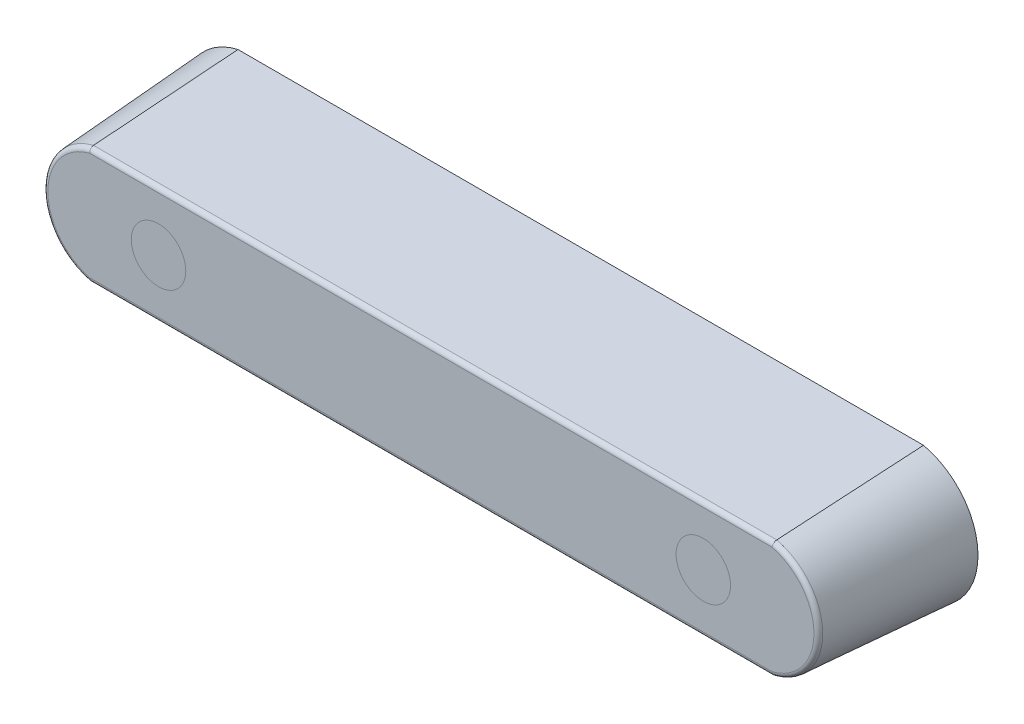
ISO-10303-21;
HEADER;
FILE_DESCRIPTION(('STEP AP214'),'2;1');
FILE_NAME('part.step','',(''),(''),'','','');
FILE_SCHEMA(('AUTOMOTIVE_DESIGN { 1 0 10303 214 1 1 1 1 }'));
ENDSEC;
DATA;
#1=APPLICATION_CONTEXT('core data for automotive mechanical design processes');
#2=APPLICATION_PROTOCOL_DEFINITION('international standard','automotive_design',2000,#1);
#3=PRODUCT_CONTEXT('',#1,'mechanical');
#4=PRODUCT('Part','Part','',(#3));
#5=PRODUCT_RELATED_PRODUCT_CATEGORY('part','',(#4));
#6=PRODUCT_DEFINITION_FORMATION('','',#4);
#7=PRODUCT_DEFINITION_CONTEXT('part definition',#1,'design');
#8=PRODUCT_DEFINITION('design','',#6,#7);
#9=PRODUCT_DEFINITION_SHAPE('','',#8);
#10=(LENGTH_UNIT() NAMED_UNIT(*) SI_UNIT(.MILLI.,.METRE.));
#11=(NAMED_UNIT(*) PLANE_ANGLE_UNIT() SI_UNIT($,.RADIAN.));
#12=(NAMED_UNIT(*) SI_UNIT($,.STERADIAN.) SOLID_ANGLE_UNIT());
#13=UNCERTAINTY_MEASURE_WITH_UNIT(LENGTH_MEASURE(1.E-05),#10,'distance_accuracy_value','');
#14=(GEOMETRIC_REPRESENTATION_CONTEXT(3) GLOBAL_UNCERTAINTY_ASSIGNED_CONTEXT((#13)) GLOBAL_UNIT_ASSIGNED_CONTEXT((#10,
#11,#12)) REPRESENTATION_CONTEXT('',''));
#15=CARTESIAN_POINT('',(0.,0.,0.));
#16=DIRECTION('',(0.,0.,1.));
#17=DIRECTION('',(1.,0.,0.));
#18=AXIS2_PLACEMENT_3D('',#15,#16,#17);
#19=CARTESIAN_POINT('',(60.,0.,33.));
#20=DIRECTION('',(0.,0.,-1.));
#21=DIRECTION('',(-1.,0.,0.));
#22=AXIS2_PLACEMENT_3D('',#19,#20,#21);
#23=CYLINDRICAL_SURFACE('',#22,6.);
#24=CARTESIAN_POINT('',(60.,0.,33.));
#25=DIRECTION('',(0.,0.,1.));
#26=DIRECTION('',(1.,0.,0.));
#27=AXIS2_PLACEMENT_3D('',#24,#25,#26);
#28=CIRCLE('',#27,6.);
#29=CARTESIAN_POINT('',(66.,0.,33.));
#30=VERTEX_POINT('',#29);
#31=EDGE_CURVE('P0_E10',#30,#30,#28,.T.);
#32=ORIENTED_EDGE('',*,*,#31,.F.);
#33=EDGE_LOOP('',(#32));
#34=FACE_BOUND('',#33,.T.);
#35=CARTESIAN_POINT('',(60.,0.,31.));
#36=DIRECTION('',(0.,0.,1.));
#37=DIRECTION('',(1.,0.,0.));
#38=AXIS2_PLACEMENT_3D('',#35,#36,#37);
#39=CIRCLE('',#38,6.);
#40=CARTESIAN_POINT('',(66.,0.,31.));
#41=VERTEX_POINT('',#40);
#42=EDGE_CURVE('P0_E18',#41,#41,#39,.T.);
#43=ORIENTED_EDGE('',*,*,#42,.T.);
#44=EDGE_LOOP('',(#43));
#45=FACE_BOUND('',#44,.T.);
#46=ADVANCED_FACE('P0_F15',(#34,#45),#23,.T.);
#47=CARTESIAN_POINT('',(60.,0.,33.));
#48=DIRECTION('',(0.,0.,1.));
#49=DIRECTION('',(1.,0.,0.));
#50=AXIS2_PLACEMENT_3D('',#47,#48,#49);
#51=PLANE('',#50);
#52=ORIENTED_EDGE('',*,*,#31,.T.);
#53=EDGE_LOOP('',(#52));
#54=FACE_BOUND('',#53,.T.);
#55=ADVANCED_FACE('P0_F30',(#54),#51,.T.);
#56=CARTESIAN_POINT('',(60.,0.,31.));
#57=DIRECTION('',(0.,0.,1.));
#58=DIRECTION('',(1.,0.,0.));
#59=AXIS2_PLACEMENT_3D('',#56,#57,#58);
#60=PLANE('',#59);
#61=ORIENTED_EDGE('',*,*,#42,.F.);
#62=EDGE_LOOP('',(#61));
#63=FACE_BOUND('',#62,.T.);
#64=ADVANCED_FACE('P0_F28',(#63),#60,.F.);
#65=CLOSED_SHELL('',(#46,#55,#64));
#66=MANIFOLD_SOLID_BREP('P0_B1',#65);
#67=CARTESIAN_POINT('',(-60.,0.,33.));
#68=DIRECTION('',(0.,0.,-1.));
#69=DIRECTION('',(-1.,0.,0.));
#70=AXIS2_PLACEMENT_3D('',#67,#68,#69);
#71=CYLINDRICAL_SURFACE('',#70,6.);
#72=CARTESIAN_POINT('',(-60.,0.,33.));
#73=DIRECTION('',(0.,0.,1.));
#74=DIRECTION('',(1.,0.,0.));
#75=AXIS2_PLACEMENT_3D('',#72,#73,#74);
#76=CIRCLE('',#75,6.);
#77=CARTESIAN_POINT('',(-54.,0.,33.));
#78=VERTEX_POINT('',#77);
#79=EDGE_CURVE('P1_E10',#78,#78,#76,.T.);
#80=ORIENTED_EDGE('',*,*,#79,.F.);
#81=EDGE_LOOP('',(#80));
#82=FACE_BOUND('',#81,.T.);
#83=CARTESIAN_POINT('',(-60.,0.,31.));
#84=DIRECTION('',(0.,0.,1.));
#85=DIRECTION('',(1.,0.,0.));
#86=AXIS2_PLACEMENT_3D('',#83,#84,#85);
#87=CIRCLE('',#86,6.);
#88=CARTESIAN_POINT('',(-54.,0.,31.));
#89=VERTEX_POINT('',#88);
#90=EDGE_CURVE('P1_E18',#89,#89,#87,.T.);
#91=ORIENTED_EDGE('',*,*,#90,.T.);
#92=EDGE_LOOP('',(#91));
#93=FACE_BOUND('',#92,.T.);
#94=ADVANCED_FACE('P1_F15',(#82,#93),#71,.T.);
#95=CARTESIAN_POINT('',(-60.,0.,33.));
#96=DIRECTION('',(0.,0.,1.));
#97=DIRECTION('',(1.,0.,0.));
#98=AXIS2_PLACEMENT_3D('',#95,#96,#97);
#99=PLANE('',#98);
#100=ORIENTED_EDGE('',*,*,#79,.T.);
#101=EDGE_LOOP('',(#100));
#102=FACE_BOUND('',#101,.T.);
#103=ADVANCED_FACE('P1_F30',(#102),#99,.T.);
#104=CARTESIAN_POINT('',(-60.,0.,31.));
#105=DIRECTION('',(0.,0.,1.));
#106=DIRECTION('',(1.,0.,0.));
#107=AXIS2_PLACEMENT_3D('',#104,#105,#106);
#108=PLANE('',#107);
#109=ORIENTED_EDGE('',*,*,#90,.F.);
#110=EDGE_LOOP('',(#109));
#111=FACE_BOUND('',#110,.T.);
#112=ADVANCED_FACE('P1_F28',(#111),#108,.F.);
#113=CLOSED_SHELL('',(#94,#103,#112));
#114=MANIFOLD_SOLID_BREP('P1_B1',#113);
#115=CARTESIAN_POINT('',(-72.125,0.,0.));
#116=DIRECTION('',(0.,0.,-1.));
#117=DIRECTION('',(1.,0.,0.));
#118=AXIS2_PLACEMENT_3D('',#115,#116,#117);
#119=CONICAL_SURFACE('',#118,15.375,0.0663225115757847);
#120=CARTESIAN_POINT('',(-75.2469756267155,-12.8081424184076,33.));
#121=CARTESIAN_POINT('',(-75.3124419272822,-13.3543877948612,24.7758810725868));
#122=CARTESIAN_POINT('',(-75.3761075094501,-13.9006340756992,16.5517485290115));
#123=CARTESIAN_POINT('',(-75.458853393903,-14.6312540709168,5.55173646405746));
#124=CARTESIAN_POINT('',(-75.4795292694966,-14.8156269839428,2.77586900763273));
#125=CARTESIAN_POINT('',(-75.5,-15.,0.));
#126=B_SPLINE_CURVE_WITH_KNOTS('',3,(#120,#121,#122,#123,#124,#125),.UNSPECIFIED.,.F.,.F.,(4,2,
4),(0.,24.7274978434896,33.0736795445278),.UNSPECIFIED.);
#127=CARTESIAN_POINT('',(-75.2544161321461,-12.8701604375148,32.0662739004));
#128=VERTEX_POINT('',#127);
#129=CARTESIAN_POINT('',(-75.5,-15.,0.));
#130=VERTEX_POINT('',#129);
#131=EDGE_CURVE('P2_E70',#128,#130,#126,.T.);
#132=ORIENTED_EDGE('',*,*,#131,.F.);
#133=CARTESIAN_POINT('',(-72.125,0.,32.0662739004));
#134=DIRECTION('',(0.,0.,-1.));
#135=DIRECTION('',(-1.,0.,0.));
#136=AXIS2_PLACEMENT_3D('',#133,#134,#135);
#137=CIRCLE('',#136,13.2451604375148);
#138=CARTESIAN_POINT('',(-75.2544161321461,12.8701604375148,32.0662739004));
#139=VERTEX_POINT('',#138);
#140=EDGE_CURVE('P2_E26',#128,#139,#137,.T.);
#141=ORIENTED_EDGE('',*,*,#140,.T.);
#142=CARTESIAN_POINT('',(-75.2469756267155,12.8081424184075,33.));
#143=CARTESIAN_POINT('',(-75.3124419272822,13.3543877948611,24.7758810725868));
#144=CARTESIAN_POINT('',(-75.3761075094501,13.9006340756992,16.5517485290115));
#145=CARTESIAN_POINT('',(-75.458853393903,14.6312540709167,5.55173646405746));
#146=CARTESIAN_POINT('',(-75.4795292694966,14.8156269839428,2.77586900763273));
#147=CARTESIAN_POINT('',(-75.5,15.,0.));
#148=B_SPLINE_CURVE_WITH_KNOTS('',3,(#142,#143,#144,#145,#146,#147),.UNSPECIFIED.,.F.,.F.,(4,2,
4),(0.,24.7274978434896,33.0736795445278),.UNSPECIFIED.);
#149=CARTESIAN_POINT('',(-75.5,15.,0.));
#150=VERTEX_POINT('',#149);
#151=EDGE_CURVE('P2_E90',#139,#150,#148,.T.);
#152=ORIENTED_EDGE('',*,*,#151,.T.);
#153=CARTESIAN_POINT('',(-72.125,0.,0.));
#154=DIRECTION('',(0.,0.,1.));
#155=DIRECTION('',(1.,0.,0.));
#156=AXIS2_PLACEMENT_3D('',#153,#154,#155);
#157=CIRCLE('',#156,15.375);
#158=EDGE_CURVE('P2_E85',#150,#130,#157,.T.);
#159=ORIENTED_EDGE('',*,*,#158,.T.);
#160=EDGE_LOOP('',(#132,#141,#152,#159));
#161=FACE_BOUND('',#160,.T.);
#162=ADVANCED_FACE('P2_F17',(#161),#119,.T.);
#163=CARTESIAN_POINT('',(-75.5,-15.,0.));
#164=DIRECTION('',(0.,-0.99780146829205,0.0662739004000003));
#165=DIRECTION('',(0.,-0.0662739004000003,-0.99780146829205));
#166=AXIS2_PLACEMENT_3D('',#163,#164,#165);
#167=PLANE('',#166);
#168=CARTESIAN_POINT('',(0.000149616954451661,-13.96612715376,15.565702905356));
#169=DIRECTION('',(0.,-0.99780146829205,0.0662739004000003));
#170=DIRECTION('',(0.,-0.0662739004000003,-0.99780146829205));
#171=AXIS2_PLACEMENT_3D('',#168,#169,#170);
#172=CIRCLE('',#171,4.46);
#173=CARTESIAN_POINT('',(0.000149616954451661,-14.261708749544,11.1155083567734));
#174=VERTEX_POINT('',#173);
#175=EDGE_CURVE('P2_E254',#174,#174,#172,.T.);
#176=ORIENTED_EDGE('',*,*,#175,.F.);
#177=EDGE_LOOP('',(#176));
#178=FACE_BOUND('',#177,.T.);
#179=CARTESIAN_POINT('',(75.2469756267155,-12.8081424184075,33.));
#180=CARTESIAN_POINT('',(75.3124419272822,-13.3543877948611,24.7758810725868));
#181=CARTESIAN_POINT('',(75.3761075094501,-13.9006340756992,16.5517485290115));
#182=CARTESIAN_POINT('',(75.458853393903,-14.6312540709167,5.55173646405748));
#183=CARTESIAN_POINT('',(75.4795292694966,-14.8156269839428,2.77586900763274));
#184=CARTESIAN_POINT('',(75.5,-15.,0.));
#185=B_SPLINE_CURVE_WITH_KNOTS('',3,(#179,#180,#181,#182,#183,#184),.UNSPECIFIED.,.F.,.F.,(4,2,
4),(0.,24.7274978434896,33.0736795445278),.UNSPECIFIED.);
#186=CARTESIAN_POINT('',(75.254416132146,-12.8701604375148,32.0662739004));
#187=VERTEX_POINT('',#186);
#188=CARTESIAN_POINT('',(75.5,-15.,0.));
#189=VERTEX_POINT('',#188);
#190=EDGE_CURVE('P2_E79',#187,#189,#185,.T.);
#191=ORIENTED_EDGE('',*,*,#190,.F.);
#192=DIRECTION('',(1.,0.,0.));
#193=VECTOR('',#192,1.);
#194=CARTESIAN_POINT('',(-75.2469756267155,-12.8701604375148,32.0662739004));
#195=LINE('',#194,#193);
#196=EDGE_CURVE('P2_E33',#187,#128,#195,.F.);
#197=ORIENTED_EDGE('',*,*,#196,.T.);
#198=ORIENTED_EDGE('',*,*,#131,.T.);
#199=DIRECTION('',(1.,0.,0.));
#200=VECTOR('',#199,1.);
#201=CARTESIAN_POINT('',(-75.5,-15.,0.));
#202=LINE('',#201,#200);
#203=EDGE_CURVE('P2_E73',#130,#189,#202,.T.);
#204=ORIENTED_EDGE('',*,*,#203,.T.);
#205=EDGE_LOOP('',(#191,#197,#198,#204));
#206=FACE_BOUND('',#205,.T.);
#207=ADVANCED_FACE('P2_F72',(#178,#206),#167,.T.);
#208=CARTESIAN_POINT('',(72.125,0.,0.));
#209=DIRECTION('',(0.,0.,-1.));
#210=DIRECTION('',(-1.,0.,0.));
#211=AXIS2_PLACEMENT_3D('',#208,#209,#210);
#212=CONICAL_SURFACE('',#211,15.375,0.0663225115757847);
#213=CARTESIAN_POINT('',(75.2469756267155,12.8081424184075,33.));
#214=CARTESIAN_POINT('',(75.3124419272822,13.3543877948611,24.7758810725868));
#215=CARTESIAN_POINT('',(75.3761075094501,13.9006340756992,16.5517485290115));
#216=CARTESIAN_POINT('',(75.458853393903,14.6312540709167,5.55173646405748));
#217=CARTESIAN_POINT('',(75.4795292694966,14.8156269839428,2.77586900763274));
#218=CARTESIAN_POINT('',(75.5,15.,0.));
#219=B_SPLINE_CURVE_WITH_KNOTS('',3,(#213,#214,#215,#216,#217,#218),.UNSPECIFIED.,.F.,.F.,(4,2,
4),(0.,24.7274978434896,33.0736795445278),.UNSPECIFIED.);
#220=CARTESIAN_POINT('',(75.254416132146,12.8701604375148,32.0662739004));
#221=VERTEX_POINT('',#220);
#222=CARTESIAN_POINT('',(75.5,15.,0.));
#223=VERTEX_POINT('',#222);
#224=EDGE_CURVE('P2_E128',#221,#223,#219,.T.);
#225=ORIENTED_EDGE('',*,*,#224,.F.);
#226=CARTESIAN_POINT('',(72.125,0.,32.0662739004));
#227=DIRECTION('',(0.,0.,-1.));
#228=DIRECTION('',(-1.,0.,0.));
#229=AXIS2_PLACEMENT_3D('',#226,#227,#228);
#230=CIRCLE('',#229,13.2451604375148);
#231=EDGE_CURVE('P2_E41',#221,#187,#230,.T.);
#232=ORIENTED_EDGE('',*,*,#231,.T.);
#233=ORIENTED_EDGE('',*,*,#190,.T.);
#234=CARTESIAN_POINT('',(72.125,0.,0.));
#235=DIRECTION('',(0.,0.,1.));
#236=DIRECTION('',(-1.,0.,0.));
#237=AXIS2_PLACEMENT_3D('',#234,#235,#236);
#238=CIRCLE('',#237,15.375);
#239=EDGE_CURVE('P2_E87',#189,#223,#238,.T.);
#240=ORIENTED_EDGE('',*,*,#239,.T.);
#241=EDGE_LOOP('',(#225,#232,#233,#240));
#242=FACE_BOUND('',#241,.T.);
#243=ADVANCED_FACE('P2_F123',(#242),#212,.T.);
#244=CARTESIAN_POINT('',(-75.5,15.,0.));
#245=DIRECTION('',(0.,0.99780146829205,0.0662739004000003));
#246=DIRECTION('',(0.,-0.0662739004000003,0.99780146829205));
#247=AXIS2_PLACEMENT_3D('',#244,#245,#246);
#248=PLANE('',#247);
#249=ORIENTED_EDGE('',*,*,#151,.F.);
#250=DIRECTION('',(-1.,0.,0.));
#251=VECTOR('',#250,1.);
#252=CARTESIAN_POINT('',(75.2469756267155,12.8701604375148,32.0662739004));
#253=LINE('',#252,#251);
#254=EDGE_CURVE('P2_E145',#139,#221,#253,.F.);
#255=ORIENTED_EDGE('',*,*,#254,.T.);
#256=ORIENTED_EDGE('',*,*,#224,.T.);
#257=DIRECTION('',(-1.,0.,0.));
#258=VECTOR('',#257,1.);
#259=CARTESIAN_POINT('',(-75.5,15.,0.));
#260=LINE('',#259,#258);
#261=EDGE_CURVE('P2_E101',#223,#150,#260,.T.);
#262=ORIENTED_EDGE('',*,*,#261,.T.);
#263=EDGE_LOOP('',(#249,#255,#256,#262));
#264=FACE_BOUND('',#263,.T.);
#265=ADVANCED_FACE('P2_F117',(#264),#248,.T.);
#266=CARTESIAN_POINT('',(-72.125,0.,33.));
#267=DIRECTION('',(0.,0.,1.));
#268=DIRECTION('',(1.,0.,0.));
#269=AXIS2_PLACEMENT_3D('',#266,#267,#268);
#270=PLANE('',#269);
#271=CARTESIAN_POINT('',(60.,0.,33.));
#272=DIRECTION('',(0.,0.,1.));
#273=DIRECTION('',(1.,0.,0.));
#274=AXIS2_PLACEMENT_3D('',#271,#272,#273);
#275=CIRCLE('',#274,5.99999999999999);
#276=CARTESIAN_POINT('',(66.,0.,33.));
#277=VERTEX_POINT('',#276);
#278=EDGE_CURVE('P2_E259',#277,#277,#275,.T.);
#279=ORIENTED_EDGE('',*,*,#278,.F.);
#280=EDGE_LOOP('',(#279));
#281=FACE_BOUND('',#280,.T.);
#282=CARTESIAN_POINT('',(-60.,0.,33.));
#283=DIRECTION('',(0.,0.,1.));
#284=DIRECTION('',(1.,0.,0.));
#285=AXIS2_PLACEMENT_3D('',#282,#283,#284);
#286=CIRCLE('',#285,6.);
#287=CARTESIAN_POINT('',(-54.,0.,33.));
#288=VERTEX_POINT('',#287);
#289=EDGE_CURVE('P2_E97',#288,#288,#286,.T.);
#290=ORIENTED_EDGE('',*,*,#289,.F.);
#291=EDGE_LOOP('',(#290));
#292=FACE_BOUND('',#291,.T.);
#293=CARTESIAN_POINT('',(72.125,0.,33.));
#294=DIRECTION('',(0.,0.,1.));
#295=DIRECTION('',(1.,0.,0.));
#296=AXIS2_PLACEMENT_3D('',#293,#294,#295);
#297=CIRCLE('',#296,12.2473589692227);
#298=CARTESIAN_POINT('',(75.1324730633735,-11.8723589692227,33.));
#299=VERTEX_POINT('',#298);
#300=CARTESIAN_POINT('',(75.1324730633735,11.8723589692227,33.));
#301=VERTEX_POINT('',#300);
#302=EDGE_CURVE('P2_E140',#299,#301,#297,.T.);
#303=ORIENTED_EDGE('',*,*,#302,.T.);
#304=DIRECTION('',(1.,0.,0.));
#305=VECTOR('',#304,1.);
#306=CARTESIAN_POINT('',(-75.2469756267155,11.8723589692227,33.));
#307=LINE('',#306,#305);
#308=CARTESIAN_POINT('',(-75.1324730633735,11.8723589692227,33.));
#309=VERTEX_POINT('',#308);
#310=EDGE_CURVE('P2_E142',#301,#309,#307,.F.);
#311=ORIENTED_EDGE('',*,*,#310,.T.);
#312=CARTESIAN_POINT('',(-72.125,0.,33.));
#313=DIRECTION('',(0.,0.,1.));
#314=DIRECTION('',(1.,0.,0.));
#315=AXIS2_PLACEMENT_3D('',#312,#313,#314);
#316=CIRCLE('',#315,12.2473589692227);
#317=CARTESIAN_POINT('',(-75.1324730633735,-11.8723589692228,33.));
#318=VERTEX_POINT('',#317);
#319=EDGE_CURVE('P2_E78',#309,#318,#316,.T.);
#320=ORIENTED_EDGE('',*,*,#319,.T.);
#321=DIRECTION('',(-1.,0.,0.));
#322=VECTOR('',#321,1.);
#323=CARTESIAN_POINT('',(75.2469756267155,-11.8723589692227,33.));
#324=LINE('',#323,#322);
#325=EDGE_CURVE('P2_E138',#318,#299,#324,.F.);
#326=ORIENTED_EDGE('',*,*,#325,.T.);
#327=EDGE_LOOP('',(#303,#311,#320,#326));
#328=FACE_BOUND('',#327,.T.);
#329=ADVANCED_FACE('P2_F122',(#281,#292,#328),#270,.T.);
#330=CARTESIAN_POINT('',(-72.125,0.,0.));
#331=DIRECTION('',(0.,0.,1.));
#332=DIRECTION('',(1.,0.,0.));
#333=AXIS2_PLACEMENT_3D('',#330,#331,#332);
#334=PLANE('',#333);
#335=CARTESIAN_POINT('',(0.,-9.99999999999997,0.));
#336=DIRECTION('',(0.,0.,1.));
#337=DIRECTION('',(1.,0.,0.));
#338=AXIS2_PLACEMENT_3D('',#335,#336,#337);
#339=CIRCLE('',#338,2.);
#340=CARTESIAN_POINT('',(2.,-9.99999999999997,0.));
#341=VERTEX_POINT('',#340);
#342=EDGE_CURVE('P2_E11',#341,#341,#339,.F.);
#343=ORIENTED_EDGE('',*,*,#342,.F.);
#344=EDGE_LOOP('',(#343));
#345=FACE_BOUND('',#344,.T.);
#346=ORIENTED_EDGE('',*,*,#158,.F.);
#347=ORIENTED_EDGE('',*,*,#261,.F.);
#348=ORIENTED_EDGE('',*,*,#239,.F.);
#349=ORIENTED_EDGE('',*,*,#203,.F.);
#350=EDGE_LOOP('',(#346,#347,#348,#349));
#351=FACE_BOUND('',#350,.T.);
#352=ADVANCED_FACE('P2_F83',(#345,#351),#334,.F.);
#353=CARTESIAN_POINT('',(-72.125,-11.8723589692228,32.));
#354=DIRECTION('',(1.,0.,0.));
#355=DIRECTION('',(0.,1.,0.));
#356=AXIS2_PLACEMENT_3D('',#353,#354,#355);
#357=CYLINDRICAL_SURFACE('',#356,1.);
#358=CARTESIAN_POINT('',(-75.2544161321461,-12.8701604375148,32.0662739004));
#359=CARTESIAN_POINT('',(-75.2541936709649,-12.8683042304727,32.0942192169498));
#360=CARTESIAN_POINT('',(-75.2538306165969,-12.8652744183657,32.1220719226569));
#361=CARTESIAN_POINT('',(-75.2528258953222,-12.8568927203765,32.1774187452211));
#362=CARTESIAN_POINT('',(-75.252184246719,-12.8515409870429,32.2049128855134));
#363=CARTESIAN_POINT('',(-75.2498479759894,-12.8320631657051,32.2865059276318));
#364=CARTESIAN_POINT('',(-75.2477412164545,-12.8145076509534,32.3398162310157));
#365=CARTESIAN_POINT('',(-75.2424843362989,-12.7707689819032,32.4427076960941));
#366=CARTESIAN_POINT('',(-75.2393337994009,-12.7445823853953,32.4922873602459));
#367=CARTESIAN_POINT('',(-75.2320727534668,-12.6843506113099,32.586331960196));
#368=CARTESIAN_POINT('',(-75.2279624452428,-12.6503070776501,32.6307979630206));
#369=CARTESIAN_POINT('',(-75.2188739496996,-12.5752137928676,32.7135318773182));
#370=CARTESIAN_POINT('',(-75.2138928238259,-12.5341403295807,32.7517779280696));
#371=CARTESIAN_POINT('',(-75.2032007669435,-12.446221908659,32.820857809918));
#372=CARTESIAN_POINT('',(-75.197489469076,-12.3993740502338,32.8516878924328));
#373=CARTESIAN_POINT('',(-75.1854458917324,-12.3008900417365,32.9052787425768));
#374=CARTESIAN_POINT('',(-75.1791092696409,-12.2492205649558,32.9279771523183));
#375=CARTESIAN_POINT('',(-75.1660262048457,-12.142897069583,32.9643424968113));
#376=CARTESIAN_POINT('',(-75.1592803759823,-12.0882475331649,32.9780226108869));
#377=CARTESIAN_POINT('',(-75.1493960483623,-12.0084495653744,32.9910079232153));
#378=CARTESIAN_POINT('',(-75.1463442496649,-11.9838488467057,32.9940750150368));
#379=CARTESIAN_POINT('',(-75.1402139098493,-11.9345074287019,32.9983731602614));
#380=CARTESIAN_POINT('',(-75.1371354011344,-11.90976690902,32.9996061909209));
#381=CARTESIAN_POINT('',(-75.1335257044437,-11.8808021798149,32.9999733048014));
#382=CARTESIAN_POINT('',(-75.1329994329585,-11.8765804109054,33.0000000467035));
#383=CARTESIAN_POINT('',(-75.1324730633735,-11.8723589692228,33.));
#384=B_SPLINE_CURVE_WITH_KNOTS('',3,(#358,#359,#360,#361,#362,#363,#364,#365,#366,#367,#368,
#369,#370,#371,#372,#373,#374,#375,#376,#377,#378,#379,#380,#381,#382,#383),.UNSPECIFIED.,.F.,
.F.,(4,2,2,2,2,2,2,2,2,2,2,2,4),(0.,0.083971468404868,0.167937420775453,0.335570158179123,
0.503269831180279,0.670934447911019,0.839176168478385,1.00750275306136,1.17709383552035,
1.34643652513384,1.42132133478929,1.49612535430689,1.50888853510224),.UNSPECIFIED.);
#385=EDGE_CURVE('P2_E95',#128,#318,#384,.T.);
#386=ORIENTED_EDGE('',*,*,#385,.F.);
#387=ORIENTED_EDGE('',*,*,#196,.F.);
#388=CARTESIAN_POINT('',(75.254416132146,-12.8701604375148,32.0662739004));
#389=CARTESIAN_POINT('',(75.2541936709648,-12.8683042304726,32.0942192169498));
#390=CARTESIAN_POINT('',(75.2538306165968,-12.8652744183657,32.1220719226569));
#391=CARTESIAN_POINT('',(75.2528258953222,-12.8568927203764,32.1774187452211));
#392=CARTESIAN_POINT('',(75.2521842467189,-12.8515409870429,32.2049128855134));
#393=CARTESIAN_POINT('',(75.2498479759893,-12.8320631657051,32.2865059276318));
#394=CARTESIAN_POINT('',(75.2477412164545,-12.8145076509533,32.3398162310157));
#395=CARTESIAN_POINT('',(75.2424843362989,-12.7707689819031,32.4427076960941));
#396=CARTESIAN_POINT('',(75.2393337994009,-12.7445823853952,32.4922873602459));
#397=CARTESIAN_POINT('',(75.2320727534667,-12.6843506113099,32.586331960196));
#398=CARTESIAN_POINT('',(75.2279624452427,-12.6503070776501,32.6307979630206));
#399=CARTESIAN_POINT('',(75.2188739496996,-12.5752137928676,32.7135318773182));
#400=CARTESIAN_POINT('',(75.2138928238258,-12.5341403295807,32.7517779280696));
#401=CARTESIAN_POINT('',(75.2032007669435,-12.4462219086589,32.820857809918));
#402=CARTESIAN_POINT('',(75.197489469076,-12.3993740502337,32.8516878924328));
#403=CARTESIAN_POINT('',(75.1854458917323,-12.3008900417365,32.9052787425768));
#404=CARTESIAN_POINT('',(75.1791092696408,-12.2492205649558,32.9279771523183));
#405=CARTESIAN_POINT('',(75.1660262048457,-12.142897069583,32.9643424968113));
#406=CARTESIAN_POINT('',(75.1592803759823,-12.0882475331649,32.9780226108869));
#407=CARTESIAN_POINT('',(75.1493960483623,-12.0084495653744,32.9910079232153));
#408=CARTESIAN_POINT('',(75.1463442496649,-11.9838488467056,32.9940750150368));
#409=CARTESIAN_POINT('',(75.1402139098492,-11.9345074287019,32.9983731602614));
#410=CARTESIAN_POINT('',(75.1371354011344,-11.9097669090199,32.9996061909209));
#411=CARTESIAN_POINT('',(75.1335257044437,-11.8808021798149,32.9999733048014));
#412=CARTESIAN_POINT('',(75.1329994329584,-11.8765804109053,33.0000000467035));
#413=CARTESIAN_POINT('',(75.1324730633735,-11.8723589692227,33.));
#414=B_SPLINE_CURVE_WITH_KNOTS('',3,(#388,#389,#390,#391,#392,#393,#394,#395,#396,#397,#398,
#399,#400,#401,#402,#403,#404,#405,#406,#407,#408,#409,#410,#411,#412,#413),.UNSPECIFIED.,.F.,
.F.,(4,2,2,2,2,2,2,2,2,2,2,2,4),(0.,0.0839714684048679,0.167937420775453,0.335570158179122,
0.503269831180273,0.670934447911018,0.839176168478385,1.00750275306136,1.17709383552035,
1.34643652513384,1.42132133478929,1.49612535430689,1.50888853510224),.UNSPECIFIED.);
#415=EDGE_CURVE('P2_E92',#299,#187,#414,.F.);
#416=ORIENTED_EDGE('',*,*,#415,.F.);
#417=ORIENTED_EDGE('',*,*,#325,.F.);
#418=EDGE_LOOP('',(#386,#387,#416,#417));
#419=FACE_BOUND('',#418,.T.);
#420=ADVANCED_FACE('P2_F19',(#419),#357,.T.);
#421=CARTESIAN_POINT('',(72.125,0.,32.));
#422=DIRECTION('',(0.,0.,1.));
#423=DIRECTION('',(1.,0.,0.));
#424=AXIS2_PLACEMENT_3D('',#421,#422,#423);
#425=TOROIDAL_SURFACE('',#424,12.2473589692227,1.);
#426=ORIENTED_EDGE('',*,*,#415,.T.);
#427=ORIENTED_EDGE('',*,*,#231,.F.);
#428=CARTESIAN_POINT('',(75.254416132146,12.8701604375148,32.0662739004));
#429=CARTESIAN_POINT('',(75.2541936709648,12.8683042304726,32.0942192169498));
#430=CARTESIAN_POINT('',(75.2538306165968,12.8652744183656,32.1220719226569));
#431=CARTESIAN_POINT('',(75.2528258953222,12.8568927203764,32.1774187452211));
#432=CARTESIAN_POINT('',(75.2521842467189,12.8515409870429,32.2049128855134));
#433=CARTESIAN_POINT('',(75.2498479759893,12.8320631657051,32.2865059276318));
#434=CARTESIAN_POINT('',(75.2477412164545,12.8145076509533,32.3398162310157));
#435=CARTESIAN_POINT('',(75.2424843362989,12.7707689819031,32.4427076960941));
#436=CARTESIAN_POINT('',(75.2393337994009,12.7445823853952,32.4922873602459));
#437=CARTESIAN_POINT('',(75.2320727534667,12.6843506113099,32.586331960196));
#438=CARTESIAN_POINT('',(75.2279624452427,12.6503070776501,32.6307979630206));
#439=CARTESIAN_POINT('',(75.2188739496996,12.5752137928676,32.7135318773182));
#440=CARTESIAN_POINT('',(75.2138928238258,12.5341403295807,32.7517779280696));
#441=CARTESIAN_POINT('',(75.2032007669435,12.4462219086589,32.820857809918));
#442=CARTESIAN_POINT('',(75.197489469076,12.3993740502337,32.8516878924328));
#443=CARTESIAN_POINT('',(75.1854458917323,12.3008900417365,32.9052787425768));
#444=CARTESIAN_POINT('',(75.1791092696408,12.2492205649558,32.9279771523183));
#445=CARTESIAN_POINT('',(75.1660262048457,12.142897069583,32.9643424968113));
#446=CARTESIAN_POINT('',(75.1592803759823,12.0882475331649,32.9780226108869));
#447=CARTESIAN_POINT('',(75.1493960483623,12.0084495653744,32.9910079232153));
#448=CARTESIAN_POINT('',(75.1463442496649,11.9838488467056,32.9940750150368));
#449=CARTESIAN_POINT('',(75.1402139098492,11.9345074287019,32.9983731602614));
#450=CARTESIAN_POINT('',(75.1371354011344,11.9097669090199,32.9996061909209));
#451=CARTESIAN_POINT('',(75.1335257044437,11.8808021798149,32.9999733048014));
#452=CARTESIAN_POINT('',(75.1329994329584,11.8765804109053,33.0000000467035));
#453=CARTESIAN_POINT('',(75.1324730633735,11.8723589692227,33.));
#454=B_SPLINE_CURVE_WITH_KNOTS('',3,(#428,#429,#430,#431,#432,#433,#434,#435,#436,#437,#438,
#439,#440,#441,#442,#443,#444,#445,#446,#447,#448,#449,#450,#451,#452,#453),.UNSPECIFIED.,.F.,
.F.,(4,2,2,2,2,2,2,2,2,2,2,2,4),(0.,0.0839714684048679,0.167937420775453,0.335570158179122,
0.503269831180272,0.670934447911018,0.839176168478386,1.00750275306136,1.17709383552035,
1.34643652513384,1.42132133478928,1.49612535430689,1.50888853510224),.UNSPECIFIED.);
#455=EDGE_CURVE('P2_E157',#301,#221,#454,.F.);
#456=ORIENTED_EDGE('',*,*,#455,.F.);
#457=ORIENTED_EDGE('',*,*,#302,.F.);
#458=EDGE_LOOP('',(#426,#427,#456,#457));
#459=FACE_BOUND('',#458,.T.);
#460=ADVANCED_FACE('P2_F168',(#459),#425,.T.);
#461=CARTESIAN_POINT('',(-72.125,0.,32.));
#462=DIRECTION('',(0.,0.,1.));
#463=DIRECTION('',(1.,0.,0.));
#464=AXIS2_PLACEMENT_3D('',#461,#462,#463);
#465=TOROIDAL_SURFACE('',#464,12.2473589692227,1.);
#466=ORIENTED_EDGE('',*,*,#385,.T.);
#467=ORIENTED_EDGE('',*,*,#319,.F.);
#468=CARTESIAN_POINT('',(-75.2544161321461,12.8701604375148,32.0662739004));
#469=CARTESIAN_POINT('',(-75.2541936709649,12.8683042304726,32.0942192169498));
#470=CARTESIAN_POINT('',(-75.2538306165969,12.8652744183656,32.1220719226569));
#471=CARTESIAN_POINT('',(-75.2528258953222,12.8568927203764,32.1774187452211));
#472=CARTESIAN_POINT('',(-75.252184246719,12.8515409870429,32.2049128855134));
#473=CARTESIAN_POINT('',(-75.2498479759894,12.8320631657051,32.2865059276318));
#474=CARTESIAN_POINT('',(-75.2477412164545,12.8145076509533,32.3398162310157));
#475=CARTESIAN_POINT('',(-75.2424843362989,12.7707689819031,32.4427076960941));
#476=CARTESIAN_POINT('',(-75.2393337994009,12.7445823853952,32.4922873602459));
#477=CARTESIAN_POINT('',(-75.2320727534668,12.6843506113099,32.586331960196));
#478=CARTESIAN_POINT('',(-75.2279624452428,12.6503070776501,32.6307979630206));
#479=CARTESIAN_POINT('',(-75.2188739496996,12.5752137928676,32.7135318773182));
#480=CARTESIAN_POINT('',(-75.2138928238259,12.5341403295807,32.7517779280696));
#481=CARTESIAN_POINT('',(-75.2032007669435,12.4462219086589,32.820857809918));
#482=CARTESIAN_POINT('',(-75.197489469076,12.3993740502337,32.8516878924328));
#483=CARTESIAN_POINT('',(-75.1854458917324,12.3008900417365,32.9052787425768));
#484=CARTESIAN_POINT('',(-75.1791092696409,12.2492205649558,32.9279771523183));
#485=CARTESIAN_POINT('',(-75.1660262048457,12.142897069583,32.9643424968113));
#486=CARTESIAN_POINT('',(-75.1592803759823,12.0882475331649,32.9780226108869));
#487=CARTESIAN_POINT('',(-75.1493960483623,12.0084495653744,32.9910079232153));
#488=CARTESIAN_POINT('',(-75.1463442496649,11.9838488467056,32.9940750150368));
#489=CARTESIAN_POINT('',(-75.1402139098493,11.9345074287019,32.9983731602614));
#490=CARTESIAN_POINT('',(-75.1371354011344,11.9097669090199,32.9996061909209));
#491=CARTESIAN_POINT('',(-75.1335257044437,11.8808021798149,32.9999733048014));
#492=CARTESIAN_POINT('',(-75.1329994329585,11.8765804109053,33.0000000467035));
#493=CARTESIAN_POINT('',(-75.1324730633735,11.8723589692227,33.));
#494=B_SPLINE_CURVE_WITH_KNOTS('',3,(#468,#469,#470,#471,#472,#473,#474,#475,#476,#477,#478,
#479,#480,#481,#482,#483,#484,#485,#486,#487,#488,#489,#490,#491,#492,#493),.UNSPECIFIED.,.F.,
.F.,(4,2,2,2,2,2,2,2,2,2,2,2,4),(0.,0.083971468404868,0.167937420775453,0.335570158179122,
0.503269831180279,0.670934447911019,0.839176168478385,1.00750275306136,1.17709383552035,
1.34643652513384,1.42132133478929,1.49612535430689,1.50888853510224),.UNSPECIFIED.);
#495=EDGE_CURVE('P2_E151',#139,#309,#494,.T.);
#496=ORIENTED_EDGE('',*,*,#495,.F.);
#497=ORIENTED_EDGE('',*,*,#140,.F.);
#498=EDGE_LOOP('',(#466,#467,#496,#497));
#499=FACE_BOUND('',#498,.T.);
#500=ADVANCED_FACE('P2_F165',(#499),#465,.T.);
#501=CARTESIAN_POINT('',(-72.125,11.8723589692227,32.));
#502=DIRECTION('',(-1.,0.,0.));
#503=DIRECTION('',(0.,0.,1.));
#504=AXIS2_PLACEMENT_3D('',#501,#502,#503);
#505=CYLINDRICAL_SURFACE('',#504,1.);
#506=ORIENTED_EDGE('',*,*,#455,.T.);
#507=ORIENTED_EDGE('',*,*,#254,.F.);
#508=ORIENTED_EDGE('',*,*,#495,.T.);
#509=ORIENTED_EDGE('',*,*,#310,.F.);
#510=EDGE_LOOP('',(#506,#507,#508,#509));
#511=FACE_BOUND('',#510,.T.);
#512=ADVANCED_FACE('P2_F163',(#511),#505,.T.);
#513=CARTESIAN_POINT('',(-60.,0.,28.));
#514=DIRECTION('',(0.,0.,1.));
#515=DIRECTION('',(1.,0.,0.));
#516=AXIS2_PLACEMENT_3D('',#513,#514,#515);
#517=CYLINDRICAL_SURFACE('',#516,6.);
#518=CARTESIAN_POINT('',(-60.,0.,28.));
#519=DIRECTION('',(0.,0.,1.));
#520=DIRECTION('',(1.,0.,0.));
#521=AXIS2_PLACEMENT_3D('',#518,#519,#520);
#522=CIRCLE('',#521,6.);
#523=CARTESIAN_POINT('',(-54.,0.,28.));
#524=VERTEX_POINT('',#523);
#525=EDGE_CURVE('P2_E158',#524,#524,#522,.T.);
#526=ORIENTED_EDGE('',*,*,#525,.F.);
#527=EDGE_LOOP('',(#526));
#528=FACE_BOUND('',#527,.T.);
#529=ORIENTED_EDGE('',*,*,#289,.T.);
#530=EDGE_LOOP('',(#529));
#531=FACE_BOUND('',#530,.T.);
#532=ADVANCED_FACE('P2_F203',(#528,#531),#517,.F.);
#533=CARTESIAN_POINT('',(-60.,0.,28.));
#534=DIRECTION('',(0.,0.,1.));
#535=DIRECTION('',(1.,0.,0.));
#536=AXIS2_PLACEMENT_3D('',#533,#534,#535);
#537=PLANE('',#536);
#538=ORIENTED_EDGE('',*,*,#525,.T.);
#539=EDGE_LOOP('',(#538));
#540=FACE_BOUND('',#539,.T.);
#541=ADVANCED_FACE('P2_F206',(#540),#537,.T.);
#542=CARTESIAN_POINT('',(60.,0.,28.));
#543=DIRECTION('',(0.,0.,1.));
#544=DIRECTION('',(1.,0.,0.));
#545=AXIS2_PLACEMENT_3D('',#542,#543,#544);
#546=CYLINDRICAL_SURFACE('',#545,5.99999999999999);
#547=CARTESIAN_POINT('',(60.,0.,28.));
#548=DIRECTION('',(0.,0.,1.));
#549=DIRECTION('',(1.,0.,0.));
#550=AXIS2_PLACEMENT_3D('',#547,#548,#549);
#551=CIRCLE('',#550,5.99999999999999);
#552=CARTESIAN_POINT('',(66.,0.,28.));
#553=VERTEX_POINT('',#552);
#554=EDGE_CURVE('P2_E262',#553,#553,#551,.T.);
#555=ORIENTED_EDGE('',*,*,#554,.F.);
#556=EDGE_LOOP('',(#555));
#557=FACE_BOUND('',#556,.T.);
#558=ORIENTED_EDGE('',*,*,#278,.T.);
#559=EDGE_LOOP('',(#558));
#560=FACE_BOUND('',#559,.T.);
#561=ADVANCED_FACE('P2_F210',(#557,#560),#546,.F.);
#562=CARTESIAN_POINT('',(60.,0.,28.));
#563=DIRECTION('',(0.,0.,1.));
#564=DIRECTION('',(1.,0.,0.));
#565=AXIS2_PLACEMENT_3D('',#562,#563,#564);
#566=PLANE('',#565);
#567=ORIENTED_EDGE('',*,*,#554,.T.);
#568=EDGE_LOOP('',(#567));
#569=FACE_BOUND('',#568,.T.);
#570=ADVANCED_FACE('P2_F214',(#569),#566,.T.);
#571=CARTESIAN_POINT('',(0.000149616954451294,-11.9705242171759,15.433155104556));
#572=DIRECTION('',(0.,-0.99780146829205,0.0662739004000003));
#573=DIRECTION('',(0.,-0.0662739004000003,-0.99780146829205));
#574=AXIS2_PLACEMENT_3D('',#571,#572,#573);
#575=CYLINDRICAL_SURFACE('',#574,4.46);
#576=CARTESIAN_POINT('',(0.000149616954451294,-11.9705242171759,15.433155104556));
#577=DIRECTION('',(0.,-0.99780146829205,0.0662739004000003));
#578=DIRECTION('',(0.,-0.0662739004000003,-0.99780146829205));
#579=AXIS2_PLACEMENT_3D('',#576,#577,#578);
#580=CIRCLE('',#579,4.46);
#581=CARTESIAN_POINT('',(0.000149616954451294,-12.2661058129599,10.9829605559734));
#582=VERTEX_POINT('',#581);
#583=EDGE_CURVE('P2_E256',#582,#582,#580,.T.);
#584=ORIENTED_EDGE('',*,*,#583,.F.);
#585=EDGE_LOOP('',(#584));
#586=FACE_BOUND('',#585,.T.);
#587=ORIENTED_EDGE('',*,*,#175,.T.);
#588=EDGE_LOOP('',(#587));
#589=FACE_BOUND('',#588,.T.);
#590=ADVANCED_FACE('P2_F218',(#586,#589),#575,.F.);
#591=CARTESIAN_POINT('',(0.000149616954451294,-11.9705242171759,15.433155104556));
#592=DIRECTION('',(0.,-0.99780146829205,0.0662739004000003));
#593=DIRECTION('',(0.,-0.0662739004000003,-0.99780146829205));
#594=AXIS2_PLACEMENT_3D('',#591,#592,#593);
#595=PLANE('',#594);
#596=CARTESIAN_POINT('',(0.000149616954451294,-11.9705242171759,15.433155104556));
#597=DIRECTION('',(0.,-0.99780146829205,0.0662739004000003));
#598=DIRECTION('',(0.,-0.0662739004000003,-0.99780146829205));
#599=AXIS2_PLACEMENT_3D('',#596,#597,#598);
#600=CIRCLE('',#599,2.65);
#601=CARTESIAN_POINT('',(0.000149616954451294,-12.1461500532359,12.788981213582));
#602=VERTEX_POINT('',#601);
#603=EDGE_CURVE('P2_E247',#602,#602,#600,.T.);
#604=ORIENTED_EDGE('',*,*,#603,.F.);
#605=EDGE_LOOP('',(#604));
#606=FACE_BOUND('',#605,.T.);
#607=ORIENTED_EDGE('',*,*,#583,.T.);
#608=EDGE_LOOP('',(#607));
#609=FACE_BOUND('',#608,.T.);
#610=ADVANCED_FACE('P2_F222',(#606,#609),#595,.T.);
#611=CARTESIAN_POINT('',(0.000149616954449827,-3.9881124708395,14.902963901356));
#612=DIRECTION('',(0.,-0.99780146829205,0.0662739004000003));
#613=DIRECTION('',(0.,-0.0662739004000003,-0.99780146829205));
#614=AXIS2_PLACEMENT_3D('',#611,#612,#613);
#615=CYLINDRICAL_SURFACE('',#614,2.65);
#616=CARTESIAN_POINT('',(0.000149616954449827,-3.9881124708395,14.902963901356));
#617=DIRECTION('',(0.,-0.99780146829205,0.0662739004000003));
#618=DIRECTION('',(0.,-0.0662739004000003,-0.99780146829205));
#619=AXIS2_PLACEMENT_3D('',#616,#617,#618);
#620=CIRCLE('',#619,2.65);
#621=CARTESIAN_POINT('',(0.000149616954449827,-4.1637383068995,12.258790010382));
#622=VERTEX_POINT('',#621);
#623=EDGE_CURVE('P2_E250',#622,#622,#620,.T.);
#624=ORIENTED_EDGE('',*,*,#623,.F.);
#625=EDGE_LOOP('',(#624));
#626=FACE_BOUND('',#625,.T.);
#627=ORIENTED_EDGE('',*,*,#603,.T.);
#628=EDGE_LOOP('',(#627));
#629=FACE_BOUND('',#628,.T.);
#630=ADVANCED_FACE('P2_F226',(#626,#629),#615,.F.);
#631=CARTESIAN_POINT('',(0.000149616954449827,-3.9881124708395,14.902963901356));
#632=DIRECTION('',(0.,-0.99780146829205,0.0662739004000003));
#633=DIRECTION('',(0.,-0.0662739004000003,-0.99780146829205));
#634=AXIS2_PLACEMENT_3D('',#631,#632,#633);
#635=PLANE('',#634);
#636=ORIENTED_EDGE('',*,*,#623,.T.);
#637=EDGE_LOOP('',(#636));
#638=FACE_BOUND('',#637,.T.);
#639=ADVANCED_FACE('P2_F230',(#638),#635,.T.);
#640=CARTESIAN_POINT('',(0.,-9.99999999999997,-5.));
#641=DIRECTION('',(0.,0.,1.));
#642=DIRECTION('',(1.,0.,0.));
#643=AXIS2_PLACEMENT_3D('',#640,#641,#642);
#644=CYLINDRICAL_SURFACE('',#643,2.);
#645=CARTESIAN_POINT('',(0.,-9.99999999999997,-5.));
#646=DIRECTION('',(0.,0.,-1.));
#647=DIRECTION('',(-1.,0.,0.));
#648=AXIS2_PLACEMENT_3D('',#645,#646,#647);
#649=CIRCLE('',#648,2.);
#650=CARTESIAN_POINT('',(-2.,-9.99999999999997,-5.));
#651=VERTEX_POINT('',#650);
#652=EDGE_CURVE('P2_E246',#651,#651,#649,.T.);
#653=ORIENTED_EDGE('',*,*,#652,.F.);
#654=EDGE_LOOP('',(#653));
#655=FACE_BOUND('',#654,.T.);
#656=ORIENTED_EDGE('',*,*,#342,.T.);
#657=EDGE_LOOP('',(#656));
#658=FACE_BOUND('',#657,.T.);
#659=ADVANCED_FACE('P2_F234',(#655,#658),#644,.T.);
#660=CARTESIAN_POINT('',(0.,-9.99999999999997,-5.));
#661=DIRECTION('',(0.,0.,-1.));
#662=DIRECTION('',(-1.,0.,0.));
#663=AXIS2_PLACEMENT_3D('',#660,#661,#662);
#664=PLANE('',#663);
#665=ORIENTED_EDGE('',*,*,#652,.T.);
#666=EDGE_LOOP('',(#665));
#667=FACE_BOUND('',#666,.T.);
#668=ADVANCED_FACE('P2_F238',(#667),#664,.T.);
#669=CLOSED_SHELL('',(#162,#207,#243,#265,#329,#352,#420,#460,#500,#512,#532,#541,#561,#570,
#590,#610,#630,#639,#659,#668));
#670=MANIFOLD_SOLID_BREP('P2_B1',#669);
#671=ADVANCED_BREP_SHAPE_REPRESENTATION('',(#18,#66,#114,#670),#14);
#672=SHAPE_DEFINITION_REPRESENTATION(#9,#671);
ENDSEC;
END-ISO-10303-21;
